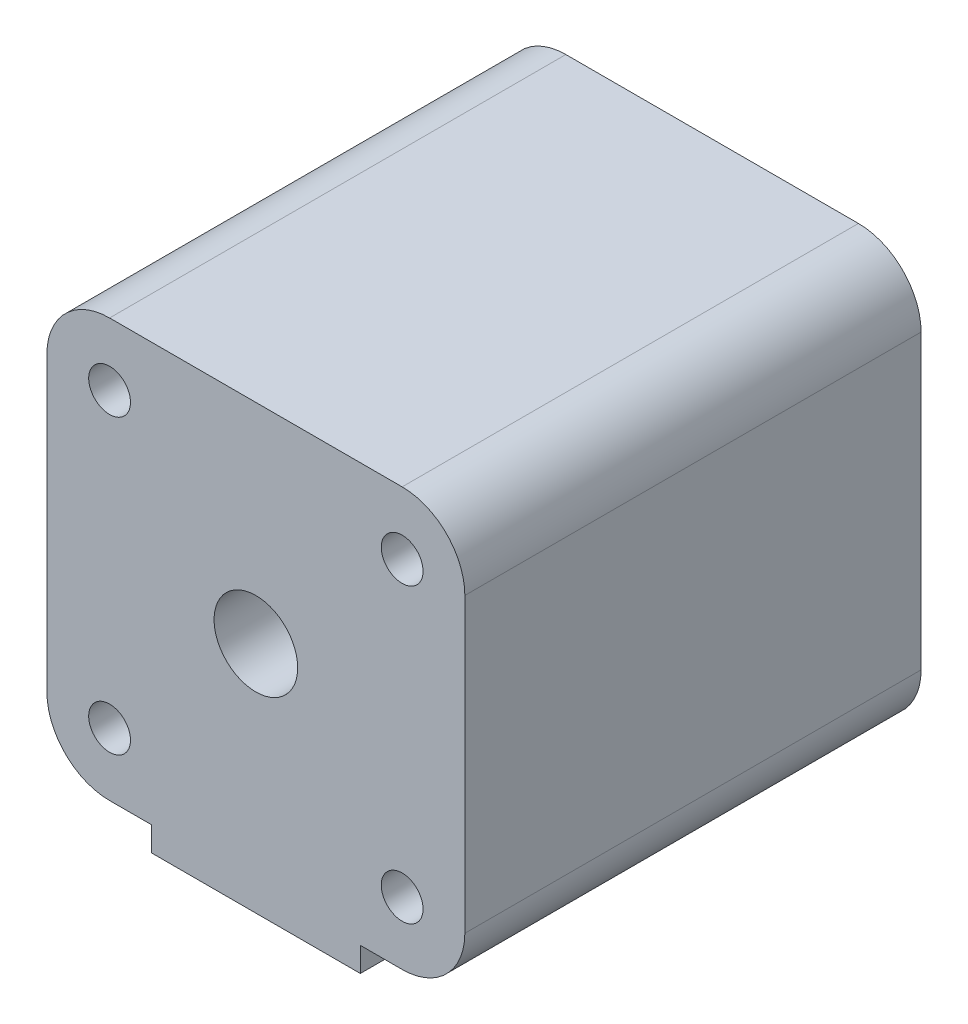
ISO-10303-21;
HEADER;
FILE_DESCRIPTION(('STEP AP214'),'2;1');
FILE_NAME('part.step','',(''),(''),'','','');
FILE_SCHEMA(('AUTOMOTIVE_DESIGN { 1 0 10303 214 1 1 1 1 }'));
ENDSEC;
DATA;
#1=APPLICATION_CONTEXT('core data for automotive mechanical design processes');
#2=APPLICATION_PROTOCOL_DEFINITION('international standard','automotive_design',2000,#1);
#3=PRODUCT_CONTEXT('',#1,'mechanical');
#4=PRODUCT('Part','Part','',(#3));
#5=PRODUCT_RELATED_PRODUCT_CATEGORY('part','',(#4));
#6=PRODUCT_DEFINITION_FORMATION('','',#4);
#7=PRODUCT_DEFINITION_CONTEXT('part definition',#1,'design');
#8=PRODUCT_DEFINITION('design','',#6,#7);
#9=PRODUCT_DEFINITION_SHAPE('','',#8);
#10=(LENGTH_UNIT() NAMED_UNIT(*) SI_UNIT(.MILLI.,.METRE.));
#11=(NAMED_UNIT(*) PLANE_ANGLE_UNIT() SI_UNIT($,.RADIAN.));
#12=(NAMED_UNIT(*) SI_UNIT($,.STERADIAN.) SOLID_ANGLE_UNIT());
#13=UNCERTAINTY_MEASURE_WITH_UNIT(LENGTH_MEASURE(1.E-05),#10,'distance_accuracy_value','');
#14=(GEOMETRIC_REPRESENTATION_CONTEXT(3) GLOBAL_UNCERTAINTY_ASSIGNED_CONTEXT((#13)) GLOBAL_UNIT_ASSIGNED_CONTEXT((#10,
#11,#12)) REPRESENTATION_CONTEXT('',''));
#15=CARTESIAN_POINT('',(0.,0.,0.));
#16=DIRECTION('',(0.,0.,1.));
#17=DIRECTION('',(1.,0.,0.));
#18=AXIS2_PLACEMENT_3D('',#15,#16,#17);
#19=CARTESIAN_POINT('',(21.,21.,-65.5));
#20=DIRECTION('',(0.,0.,1.));
#21=DIRECTION('',(1.,0.,0.));
#22=AXIS2_PLACEMENT_3D('',#19,#20,#21);
#23=CYLINDRICAL_SURFACE('',#22,9.);
#24=CARTESIAN_POINT('',(21.,21.,0.));
#25=DIRECTION('',(0.,0.,1.));
#26=DIRECTION('',(-1.,0.,0.));
#27=AXIS2_PLACEMENT_3D('',#24,#25,#26);
#28=CIRCLE('',#27,9.);
#29=CARTESIAN_POINT('',(30.,21.,0.));
#30=VERTEX_POINT('',#29);
#31=CARTESIAN_POINT('',(20.9999999999999,30.,0.));
#32=VERTEX_POINT('',#31);
#33=EDGE_CURVE('E154',#30,#32,#28,.T.);
#34=ORIENTED_EDGE('',*,*,#33,.F.);
#35=DIRECTION('',(0.,0.,1.));
#36=VECTOR('',#35,1.);
#37=CARTESIAN_POINT('',(30.,21.,-65.5));
#38=LINE('',#37,#36);
#39=CARTESIAN_POINT('',(30.,21.,-65.5));
#40=VERTEX_POINT('',#39);
#41=EDGE_CURVE('E11',#40,#30,#38,.T.);
#42=ORIENTED_EDGE('',*,*,#41,.F.);
#43=CARTESIAN_POINT('',(21.,21.,-65.5));
#44=DIRECTION('',(0.,0.,1.));
#45=DIRECTION('',(-1.,0.,0.));
#46=AXIS2_PLACEMENT_3D('',#43,#44,#45);
#47=CIRCLE('',#46,9.);
#48=CARTESIAN_POINT('',(20.9999999999999,30.,-65.5));
#49=VERTEX_POINT('',#48);
#50=EDGE_CURVE('E187',#40,#49,#47,.T.);
#51=ORIENTED_EDGE('',*,*,#50,.T.);
#52=DIRECTION('',(0.,0.,1.));
#53=VECTOR('',#52,1.);
#54=CARTESIAN_POINT('',(20.9999999999999,30.,-65.5));
#55=LINE('',#54,#53);
#56=EDGE_CURVE('E36',#49,#32,#55,.T.);
#57=ORIENTED_EDGE('',*,*,#56,.T.);
#58=EDGE_LOOP('',(#34,#42,#51,#57));
#59=FACE_BOUND('',#58,.T.);
#60=ADVANCED_FACE('F33',(#59),#23,.T.);
#61=CARTESIAN_POINT('',(30.,21.,-65.5));
#62=DIRECTION('',(1.,0.,0.));
#63=DIRECTION('',(0.,1.,0.));
#64=AXIS2_PLACEMENT_3D('',#61,#62,#63);
#65=PLANE('',#64);
#66=DIRECTION('',(0.,1.,0.));
#67=VECTOR('',#66,1.);
#68=CARTESIAN_POINT('',(30.,21.,0.));
#69=LINE('',#68,#67);
#70=CARTESIAN_POINT('',(30.,-20.9999999999999,0.));
#71=VERTEX_POINT('',#70);
#72=EDGE_CURVE('E185',#71,#30,#69,.T.);
#73=ORIENTED_EDGE('',*,*,#72,.F.);
#74=DIRECTION('',(0.,0.,1.));
#75=VECTOR('',#74,1.);
#76=CARTESIAN_POINT('',(30.,-20.9999999999999,-65.5));
#77=LINE('',#76,#75);
#78=CARTESIAN_POINT('',(30.,-20.9999999999999,-65.5));
#79=VERTEX_POINT('',#78);
#80=EDGE_CURVE('E42',#79,#71,#77,.T.);
#81=ORIENTED_EDGE('',*,*,#80,.F.);
#82=DIRECTION('',(0.,1.,0.));
#83=VECTOR('',#82,1.);
#84=CARTESIAN_POINT('',(30.,21.,-65.5));
#85=LINE('',#84,#83);
#86=EDGE_CURVE('E144',#79,#40,#85,.T.);
#87=ORIENTED_EDGE('',*,*,#86,.T.);
#88=ORIENTED_EDGE('',*,*,#41,.T.);
#89=EDGE_LOOP('',(#73,#81,#87,#88));
#90=FACE_BOUND('',#89,.T.);
#91=ADVANCED_FACE('F207',(#90),#65,.T.);
#92=CARTESIAN_POINT('',(21.,-21.,-65.5));
#93=DIRECTION('',(0.,0.,1.));
#94=DIRECTION('',(1.,0.,0.));
#95=AXIS2_PLACEMENT_3D('',#92,#93,#94);
#96=CYLINDRICAL_SURFACE('',#95,9.);
#97=CARTESIAN_POINT('',(21.,-21.,0.));
#98=DIRECTION('',(0.,0.,1.));
#99=DIRECTION('',(-1.,0.,0.));
#100=AXIS2_PLACEMENT_3D('',#97,#98,#99);
#101=CIRCLE('',#100,9.);
#102=CARTESIAN_POINT('',(20.9999999999999,-30.,0.));
#103=VERTEX_POINT('',#102);
#104=EDGE_CURVE('E131',#103,#71,#101,.T.);
#105=ORIENTED_EDGE('',*,*,#104,.F.);
#106=DIRECTION('',(0.,0.,1.));
#107=VECTOR('',#106,1.);
#108=CARTESIAN_POINT('',(20.9999999999999,-30.,-65.5));
#109=LINE('',#108,#107);
#110=CARTESIAN_POINT('',(20.9999999999999,-30.,-65.5));
#111=VERTEX_POINT('',#110);
#112=EDGE_CURVE('E126',#111,#103,#109,.T.);
#113=ORIENTED_EDGE('',*,*,#112,.F.);
#114=CARTESIAN_POINT('',(21.,-21.,-65.5));
#115=DIRECTION('',(0.,0.,1.));
#116=DIRECTION('',(-1.,0.,0.));
#117=AXIS2_PLACEMENT_3D('',#114,#115,#116);
#118=CIRCLE('',#117,9.);
#119=EDGE_CURVE('E129',#111,#79,#118,.T.);
#120=ORIENTED_EDGE('',*,*,#119,.T.);
#121=ORIENTED_EDGE('',*,*,#80,.T.);
#122=EDGE_LOOP('',(#105,#113,#120,#121));
#123=FACE_BOUND('',#122,.T.);
#124=ADVANCED_FACE('F128',(#123),#96,.T.);
#125=CARTESIAN_POINT('',(15.,-30.,-65.5));
#126=DIRECTION('',(0.,-1.,0.));
#127=DIRECTION('',(0.,0.,-1.));
#128=AXIS2_PLACEMENT_3D('',#125,#126,#127);
#129=PLANE('',#128);
#130=DIRECTION('',(1.,0.,0.));
#131=VECTOR('',#130,1.);
#132=CARTESIAN_POINT('',(15.,-30.,0.));
#133=LINE('',#132,#131);
#134=CARTESIAN_POINT('',(15.,-30.,0.));
#135=VERTEX_POINT('',#134);
#136=EDGE_CURVE('E182',#135,#103,#133,.T.);
#137=ORIENTED_EDGE('',*,*,#136,.F.);
#138=DIRECTION('',(0.,0.,1.));
#139=VECTOR('',#138,1.);
#140=CARTESIAN_POINT('',(15.,-30.,-65.5));
#141=LINE('',#140,#139);
#142=CARTESIAN_POINT('',(15.,-30.,-65.5));
#143=VERTEX_POINT('',#142);
#144=EDGE_CURVE('E136',#143,#135,#141,.T.);
#145=ORIENTED_EDGE('',*,*,#144,.F.);
#146=DIRECTION('',(1.,0.,0.));
#147=VECTOR('',#146,1.);
#148=CARTESIAN_POINT('',(15.,-30.,-65.5));
#149=LINE('',#148,#147);
#150=EDGE_CURVE('E142',#143,#111,#149,.T.);
#151=ORIENTED_EDGE('',*,*,#150,.T.);
#152=ORIENTED_EDGE('',*,*,#112,.T.);
#153=EDGE_LOOP('',(#137,#145,#151,#152));
#154=FACE_BOUND('',#153,.T.);
#155=ADVANCED_FACE('F146',(#154),#129,.T.);
#156=CARTESIAN_POINT('',(15.,-33.5,-65.5));
#157=DIRECTION('',(1.,0.,0.));
#158=DIRECTION('',(0.,0.,-1.));
#159=AXIS2_PLACEMENT_3D('',#156,#157,#158);
#160=PLANE('',#159);
#161=DIRECTION('',(0.,1.,0.));
#162=VECTOR('',#161,1.);
#163=CARTESIAN_POINT('',(15.,-33.5,0.));
#164=LINE('',#163,#162);
#165=CARTESIAN_POINT('',(15.,-33.5,0.));
#166=VERTEX_POINT('',#165);
#167=EDGE_CURVE('E179',#166,#135,#164,.T.);
#168=ORIENTED_EDGE('',*,*,#167,.F.);
#169=DIRECTION('',(0.,0.,1.));
#170=VECTOR('',#169,1.);
#171=CARTESIAN_POINT('',(15.,-33.5,-65.5));
#172=LINE('',#171,#170);
#173=CARTESIAN_POINT('',(15.,-33.5,-65.5));
#174=VERTEX_POINT('',#173);
#175=EDGE_CURVE('E191',#174,#166,#172,.T.);
#176=ORIENTED_EDGE('',*,*,#175,.F.);
#177=DIRECTION('',(0.,1.,0.));
#178=VECTOR('',#177,1.);
#179=CARTESIAN_POINT('',(15.,-33.5,-65.5));
#180=LINE('',#179,#178);
#181=EDGE_CURVE('E147',#174,#143,#180,.T.);
#182=ORIENTED_EDGE('',*,*,#181,.T.);
#183=ORIENTED_EDGE('',*,*,#144,.T.);
#184=EDGE_LOOP('',(#168,#176,#182,#183));
#185=FACE_BOUND('',#184,.T.);
#186=ADVANCED_FACE('F220',(#185),#160,.T.);
#187=CARTESIAN_POINT('',(-15.,-33.5,-65.5));
#188=DIRECTION('',(0.,-1.,0.));
#189=DIRECTION('',(0.,0.,-1.));
#190=AXIS2_PLACEMENT_3D('',#187,#188,#189);
#191=PLANE('',#190);
#192=CARTESIAN_POINT('',(0.,-33.5,-60.));
#193=DIRECTION('',(0.,-1.,0.));
#194=DIRECTION('',(0.,0.,-1.));
#195=AXIS2_PLACEMENT_3D('',#192,#193,#194);
#196=CIRCLE('',#195,4.5);
#197=CARTESIAN_POINT('',(0.,-33.5,-64.5));
#198=VERTEX_POINT('',#197);
#199=EDGE_CURVE('E317',#198,#198,#196,.T.);
#200=ORIENTED_EDGE('',*,*,#199,.F.);
#201=EDGE_LOOP('',(#200));
#202=FACE_BOUND('',#201,.T.);
#203=CARTESIAN_POINT('',(0.,-33.5,-5.5));
#204=DIRECTION('',(0.,-1.,0.));
#205=DIRECTION('',(0.,0.,-1.));
#206=AXIS2_PLACEMENT_3D('',#203,#204,#205);
#207=CIRCLE('',#206,4.5);
#208=CARTESIAN_POINT('',(0.,-33.5,-10.));
#209=VERTEX_POINT('',#208);
#210=EDGE_CURVE('E316',#209,#209,#207,.T.);
#211=ORIENTED_EDGE('',*,*,#210,.F.);
#212=EDGE_LOOP('',(#211));
#213=FACE_BOUND('',#212,.T.);
#214=DIRECTION('',(1.,0.,0.));
#215=VECTOR('',#214,1.);
#216=CARTESIAN_POINT('',(-15.,-33.5,0.));
#217=LINE('',#216,#215);
#218=CARTESIAN_POINT('',(-15.,-33.5,0.));
#219=VERTEX_POINT('',#218);
#220=EDGE_CURVE('E176',#219,#166,#217,.T.);
#221=ORIENTED_EDGE('',*,*,#220,.F.);
#222=DIRECTION('',(0.,0.,1.));
#223=VECTOR('',#222,1.);
#224=CARTESIAN_POINT('',(-15.,-33.5,-65.5));
#225=LINE('',#224,#223);
#226=CARTESIAN_POINT('',(-15.,-33.5,-65.5));
#227=VERTEX_POINT('',#226);
#228=EDGE_CURVE('E193',#227,#219,#225,.T.);
#229=ORIENTED_EDGE('',*,*,#228,.F.);
#230=DIRECTION('',(1.,0.,0.));
#231=VECTOR('',#230,1.);
#232=CARTESIAN_POINT('',(-15.,-33.5,-65.5));
#233=LINE('',#232,#231);
#234=EDGE_CURVE('E149',#227,#174,#233,.T.);
#235=ORIENTED_EDGE('',*,*,#234,.T.);
#236=ORIENTED_EDGE('',*,*,#175,.T.);
#237=EDGE_LOOP('',(#221,#229,#235,#236));
#238=FACE_BOUND('',#237,.T.);
#239=ADVANCED_FACE('F223',(#202,#213,#238),#191,.T.);
#240=CARTESIAN_POINT('',(-15.,-30.,-65.5));
#241=DIRECTION('',(-1.,0.,0.));
#242=DIRECTION('',(0.,0.,1.));
#243=AXIS2_PLACEMENT_3D('',#240,#241,#242);
#244=PLANE('',#243);
#245=DIRECTION('',(0.,-1.,0.));
#246=VECTOR('',#245,1.);
#247=CARTESIAN_POINT('',(-15.,-30.,0.));
#248=LINE('',#247,#246);
#249=CARTESIAN_POINT('',(-15.,-30.,0.));
#250=VERTEX_POINT('',#249);
#251=EDGE_CURVE('E173',#250,#219,#248,.T.);
#252=ORIENTED_EDGE('',*,*,#251,.F.);
#253=DIRECTION('',(0.,0.,1.));
#254=VECTOR('',#253,1.);
#255=CARTESIAN_POINT('',(-15.,-30.,-65.5));
#256=LINE('',#255,#254);
#257=CARTESIAN_POINT('',(-15.,-30.,-65.5));
#258=VERTEX_POINT('',#257);
#259=EDGE_CURVE('E195',#258,#250,#256,.T.);
#260=ORIENTED_EDGE('',*,*,#259,.F.);
#261=DIRECTION('',(0.,-1.,0.));
#262=VECTOR('',#261,1.);
#263=CARTESIAN_POINT('',(-15.,-30.,-65.5));
#264=LINE('',#263,#262);
#265=EDGE_CURVE('E371',#258,#227,#264,.T.);
#266=ORIENTED_EDGE('',*,*,#265,.T.);
#267=ORIENTED_EDGE('',*,*,#228,.T.);
#268=EDGE_LOOP('',(#252,#260,#266,#267));
#269=FACE_BOUND('',#268,.T.);
#270=ADVANCED_FACE('F227',(#269),#244,.T.);
#271=CARTESIAN_POINT('',(-20.9999999999999,-30.,-65.5));
#272=DIRECTION('',(0.,-1.,0.));
#273=DIRECTION('',(0.,0.,-1.));
#274=AXIS2_PLACEMENT_3D('',#271,#272,#273);
#275=PLANE('',#274);
#276=DIRECTION('',(1.,0.,0.));
#277=VECTOR('',#276,1.);
#278=CARTESIAN_POINT('',(-20.9999999999999,-30.,0.));
#279=LINE('',#278,#277);
#280=CARTESIAN_POINT('',(-20.9999999999999,-30.,0.));
#281=VERTEX_POINT('',#280);
#282=EDGE_CURVE('E170',#281,#250,#279,.T.);
#283=ORIENTED_EDGE('',*,*,#282,.F.);
#284=DIRECTION('',(0.,0.,1.));
#285=VECTOR('',#284,1.);
#286=CARTESIAN_POINT('',(-20.9999999999999,-30.,-65.5));
#287=LINE('',#286,#285);
#288=CARTESIAN_POINT('',(-20.9999999999999,-30.,-65.5));
#289=VERTEX_POINT('',#288);
#290=EDGE_CURVE('E197',#289,#281,#287,.T.);
#291=ORIENTED_EDGE('',*,*,#290,.F.);
#292=DIRECTION('',(1.,0.,0.));
#293=VECTOR('',#292,1.);
#294=CARTESIAN_POINT('',(-20.9999999999999,-30.,-65.5));
#295=LINE('',#294,#293);
#296=EDGE_CURVE('E368',#289,#258,#295,.T.);
#297=ORIENTED_EDGE('',*,*,#296,.T.);
#298=ORIENTED_EDGE('',*,*,#259,.T.);
#299=EDGE_LOOP('',(#283,#291,#297,#298));
#300=FACE_BOUND('',#299,.T.);
#301=ADVANCED_FACE('F231',(#300),#275,.T.);
#302=CARTESIAN_POINT('',(-21.,-21.,-65.5));
#303=DIRECTION('',(0.,0.,1.));
#304=DIRECTION('',(1.,0.,0.));
#305=AXIS2_PLACEMENT_3D('',#302,#303,#304);
#306=CYLINDRICAL_SURFACE('',#305,9.);
#307=CARTESIAN_POINT('',(-21.,-21.,0.));
#308=DIRECTION('',(0.,0.,1.));
#309=DIRECTION('',(-1.,0.,0.));
#310=AXIS2_PLACEMENT_3D('',#307,#308,#309);
#311=CIRCLE('',#310,9.);
#312=CARTESIAN_POINT('',(-30.,-20.9999999999999,0.));
#313=VERTEX_POINT('',#312);
#314=EDGE_CURVE('E167',#313,#281,#311,.T.);
#315=ORIENTED_EDGE('',*,*,#314,.F.);
#316=DIRECTION('',(0.,0.,1.));
#317=VECTOR('',#316,1.);
#318=CARTESIAN_POINT('',(-30.,-20.9999999999999,-65.5));
#319=LINE('',#318,#317);
#320=CARTESIAN_POINT('',(-30.,-20.9999999999999,-65.5));
#321=VERTEX_POINT('',#320);
#322=EDGE_CURVE('E199',#321,#313,#319,.T.);
#323=ORIENTED_EDGE('',*,*,#322,.F.);
#324=CARTESIAN_POINT('',(-21.,-21.,-65.5));
#325=DIRECTION('',(0.,0.,1.));
#326=DIRECTION('',(-1.,0.,0.));
#327=AXIS2_PLACEMENT_3D('',#324,#325,#326);
#328=CIRCLE('',#327,9.);
#329=EDGE_CURVE('E365',#321,#289,#328,.T.);
#330=ORIENTED_EDGE('',*,*,#329,.T.);
#331=ORIENTED_EDGE('',*,*,#290,.T.);
#332=EDGE_LOOP('',(#315,#323,#330,#331));
#333=FACE_BOUND('',#332,.T.);
#334=ADVANCED_FACE('F235',(#333),#306,.T.);
#335=CARTESIAN_POINT('',(-30.,20.9999999999999,-65.5));
#336=DIRECTION('',(-1.,0.,0.));
#337=DIRECTION('',(0.,-1.,0.));
#338=AXIS2_PLACEMENT_3D('',#335,#336,#337);
#339=PLANE('',#338);
#340=DIRECTION('',(0.,-1.,0.));
#341=VECTOR('',#340,1.);
#342=CARTESIAN_POINT('',(-30.,20.9999999999999,0.));
#343=LINE('',#342,#341);
#344=CARTESIAN_POINT('',(-30.,21.,0.));
#345=VERTEX_POINT('',#344);
#346=EDGE_CURVE('E164',#345,#313,#343,.T.);
#347=ORIENTED_EDGE('',*,*,#346,.F.);
#348=DIRECTION('',(0.,0.,1.));
#349=VECTOR('',#348,1.);
#350=CARTESIAN_POINT('',(-30.,21.,-65.5));
#351=LINE('',#350,#349);
#352=CARTESIAN_POINT('',(-30.,21.,-65.5));
#353=VERTEX_POINT('',#352);
#354=EDGE_CURVE('E201',#353,#345,#351,.T.);
#355=ORIENTED_EDGE('',*,*,#354,.F.);
#356=DIRECTION('',(0.,-1.,0.));
#357=VECTOR('',#356,1.);
#358=CARTESIAN_POINT('',(-30.,20.9999999999999,-65.5));
#359=LINE('',#358,#357);
#360=EDGE_CURVE('E362',#353,#321,#359,.T.);
#361=ORIENTED_EDGE('',*,*,#360,.T.);
#362=ORIENTED_EDGE('',*,*,#322,.T.);
#363=EDGE_LOOP('',(#347,#355,#361,#362));
#364=FACE_BOUND('',#363,.T.);
#365=ADVANCED_FACE('F239',(#364),#339,.T.);
#366=CARTESIAN_POINT('',(-21.,21.,-65.5));
#367=DIRECTION('',(0.,0.,1.));
#368=DIRECTION('',(1.,0.,0.));
#369=AXIS2_PLACEMENT_3D('',#366,#367,#368);
#370=CYLINDRICAL_SURFACE('',#369,9.);
#371=CARTESIAN_POINT('',(-21.,21.,0.));
#372=DIRECTION('',(0.,0.,1.));
#373=DIRECTION('',(1.,0.,0.));
#374=AXIS2_PLACEMENT_3D('',#371,#372,#373);
#375=CIRCLE('',#374,9.);
#376=CARTESIAN_POINT('',(-21.,30.,0.));
#377=VERTEX_POINT('',#376);
#378=EDGE_CURVE('E161',#377,#345,#375,.T.);
#379=ORIENTED_EDGE('',*,*,#378,.F.);
#380=DIRECTION('',(0.,0.,1.));
#381=VECTOR('',#380,1.);
#382=CARTESIAN_POINT('',(-21.,30.,-65.5));
#383=LINE('',#382,#381);
#384=CARTESIAN_POINT('',(-21.,30.,-65.5));
#385=VERTEX_POINT('',#384);
#386=EDGE_CURVE('E202',#385,#377,#383,.T.);
#387=ORIENTED_EDGE('',*,*,#386,.F.);
#388=CARTESIAN_POINT('',(-21.,21.,-65.5));
#389=DIRECTION('',(0.,0.,1.));
#390=DIRECTION('',(1.,0.,0.));
#391=AXIS2_PLACEMENT_3D('',#388,#389,#390);
#392=CIRCLE('',#391,9.);
#393=EDGE_CURVE('E359',#385,#353,#392,.T.);
#394=ORIENTED_EDGE('',*,*,#393,.T.);
#395=ORIENTED_EDGE('',*,*,#354,.T.);
#396=EDGE_LOOP('',(#379,#387,#394,#395));
#397=FACE_BOUND('',#396,.T.);
#398=ADVANCED_FACE('F243',(#397),#370,.T.);
#399=CARTESIAN_POINT('',(-21.,30.,-65.5));
#400=DIRECTION('',(0.,1.,0.));
#401=DIRECTION('',(0.,0.,1.));
#402=AXIS2_PLACEMENT_3D('',#399,#400,#401);
#403=PLANE('',#402);
#404=DIRECTION('',(-1.,0.,0.));
#405=VECTOR('',#404,1.);
#406=CARTESIAN_POINT('',(-21.,30.,0.));
#407=LINE('',#406,#405);
#408=EDGE_CURVE('E157',#32,#377,#407,.T.);
#409=ORIENTED_EDGE('',*,*,#408,.F.);
#410=ORIENTED_EDGE('',*,*,#56,.F.);
#411=DIRECTION('',(-1.,0.,0.));
#412=VECTOR('',#411,1.);
#413=CARTESIAN_POINT('',(-21.,30.,-65.5));
#414=LINE('',#413,#412);
#415=EDGE_CURVE('E357',#49,#385,#414,.T.);
#416=ORIENTED_EDGE('',*,*,#415,.T.);
#417=ORIENTED_EDGE('',*,*,#386,.T.);
#418=EDGE_LOOP('',(#409,#410,#416,#417));
#419=FACE_BOUND('',#418,.T.);
#420=ADVANCED_FACE('F204',(#419),#403,.T.);
#421=CARTESIAN_POINT('',(21.,21.,-65.5));
#422=DIRECTION('',(0.,0.,-1.));
#423=DIRECTION('',(-1.,0.,0.));
#424=AXIS2_PLACEMENT_3D('',#421,#422,#423);
#425=PLANE('',#424);
#426=ORIENTED_EDGE('',*,*,#50,.F.);
#427=ORIENTED_EDGE('',*,*,#86,.F.);
#428=ORIENTED_EDGE('',*,*,#119,.F.);
#429=ORIENTED_EDGE('',*,*,#150,.F.);
#430=ORIENTED_EDGE('',*,*,#181,.F.);
#431=ORIENTED_EDGE('',*,*,#234,.F.);
#432=ORIENTED_EDGE('',*,*,#265,.F.);
#433=ORIENTED_EDGE('',*,*,#296,.F.);
#434=ORIENTED_EDGE('',*,*,#329,.F.);
#435=ORIENTED_EDGE('',*,*,#360,.F.);
#436=ORIENTED_EDGE('',*,*,#393,.F.);
#437=ORIENTED_EDGE('',*,*,#415,.F.);
#438=EDGE_LOOP('',(#426,#427,#428,#429,#430,#431,#432,#433,#434,#435,#436,#437));
#439=FACE_BOUND('',#438,.T.);
#440=ADVANCED_FACE('F140',(#439),#425,.T.);
#441=CARTESIAN_POINT('',(21.,21.,0.));
#442=DIRECTION('',(0.,0.,-1.));
#443=DIRECTION('',(-1.,0.,0.));
#444=AXIS2_PLACEMENT_3D('',#441,#442,#443);
#445=PLANE('',#444);
#446=CARTESIAN_POINT('',(0.,0.,0.));
#447=DIRECTION('',(0.,0.,1.));
#448=DIRECTION('',(1.,0.,0.));
#449=AXIS2_PLACEMENT_3D('',#446,#447,#448);
#450=CIRCLE('',#449,6.);
#451=CARTESIAN_POINT('',(6.,0.,0.));
#452=VERTEX_POINT('',#451);
#453=EDGE_CURVE('E326',#452,#452,#450,.T.);
#454=ORIENTED_EDGE('',*,*,#453,.F.);
#455=EDGE_LOOP('',(#454));
#456=FACE_BOUND('',#455,.T.);
#457=CARTESIAN_POINT('',(-21.,-21.,0.));
#458=DIRECTION('',(0.,0.,1.));
#459=DIRECTION('',(1.,0.,0.));
#460=AXIS2_PLACEMENT_3D('',#457,#458,#459);
#461=CIRCLE('',#460,3.);
#462=CARTESIAN_POINT('',(-18.,-21.,0.));
#463=VERTEX_POINT('',#462);
#464=EDGE_CURVE('E331',#463,#463,#461,.T.);
#465=ORIENTED_EDGE('',*,*,#464,.F.);
#466=EDGE_LOOP('',(#465));
#467=FACE_BOUND('',#466,.T.);
#468=CARTESIAN_POINT('',(21.,-21.,0.));
#469=DIRECTION('',(0.,0.,1.));
#470=DIRECTION('',(1.,0.,0.));
#471=AXIS2_PLACEMENT_3D('',#468,#469,#470);
#472=CIRCLE('',#471,3.);
#473=CARTESIAN_POINT('',(24.,-21.,0.));
#474=VERTEX_POINT('',#473);
#475=EDGE_CURVE('E337',#474,#474,#472,.T.);
#476=ORIENTED_EDGE('',*,*,#475,.F.);
#477=EDGE_LOOP('',(#476));
#478=FACE_BOUND('',#477,.T.);
#479=CARTESIAN_POINT('',(21.,21.,0.));
#480=DIRECTION('',(0.,0.,1.));
#481=DIRECTION('',(1.,0.,0.));
#482=AXIS2_PLACEMENT_3D('',#479,#480,#481);
#483=CIRCLE('',#482,3.);
#484=CARTESIAN_POINT('',(24.,21.,0.));
#485=VERTEX_POINT('',#484);
#486=EDGE_CURVE('E343',#485,#485,#483,.T.);
#487=ORIENTED_EDGE('',*,*,#486,.F.);
#488=EDGE_LOOP('',(#487));
#489=FACE_BOUND('',#488,.T.);
#490=CARTESIAN_POINT('',(-21.,21.,0.));
#491=DIRECTION('',(0.,0.,1.));
#492=DIRECTION('',(1.,0.,0.));
#493=AXIS2_PLACEMENT_3D('',#490,#491,#492);
#494=CIRCLE('',#493,3.);
#495=CARTESIAN_POINT('',(-18.,21.,0.));
#496=VERTEX_POINT('',#495);
#497=EDGE_CURVE('E349',#496,#496,#494,.T.);
#498=ORIENTED_EDGE('',*,*,#497,.F.);
#499=EDGE_LOOP('',(#498));
#500=FACE_BOUND('',#499,.T.);
#501=ORIENTED_EDGE('',*,*,#33,.T.);
#502=ORIENTED_EDGE('',*,*,#408,.T.);
#503=ORIENTED_EDGE('',*,*,#378,.T.);
#504=ORIENTED_EDGE('',*,*,#346,.T.);
#505=ORIENTED_EDGE('',*,*,#314,.T.);
#506=ORIENTED_EDGE('',*,*,#282,.T.);
#507=ORIENTED_EDGE('',*,*,#251,.T.);
#508=ORIENTED_EDGE('',*,*,#220,.T.);
#509=ORIENTED_EDGE('',*,*,#167,.T.);
#510=ORIENTED_EDGE('',*,*,#136,.T.);
#511=ORIENTED_EDGE('',*,*,#104,.T.);
#512=ORIENTED_EDGE('',*,*,#72,.T.);
#513=EDGE_LOOP('',(#501,#502,#503,#504,#505,#506,#507,#508,#509,#510,#511,#512));
#514=FACE_BOUND('',#513,.T.);
#515=ADVANCED_FACE('F206',(#456,#467,#478,#489,#500,#514),#445,.F.);
#516=CARTESIAN_POINT('',(-21.,21.,-20.));
#517=DIRECTION('',(0.,0.,1.));
#518=DIRECTION('',(1.,0.,0.));
#519=AXIS2_PLACEMENT_3D('',#516,#517,#518);
#520=CYLINDRICAL_SURFACE('',#519,3.);
#521=CARTESIAN_POINT('',(-21.,21.,-20.));
#522=DIRECTION('',(0.,0.,1.));
#523=DIRECTION('',(1.,0.,0.));
#524=AXIS2_PLACEMENT_3D('',#521,#522,#523);
#525=CIRCLE('',#524,3.);
#526=CARTESIAN_POINT('',(-18.,21.,-20.));
#527=VERTEX_POINT('',#526);
#528=EDGE_CURVE('E158',#527,#527,#525,.T.);
#529=ORIENTED_EDGE('',*,*,#528,.F.);
#530=EDGE_LOOP('',(#529));
#531=FACE_BOUND('',#530,.T.);
#532=ORIENTED_EDGE('',*,*,#497,.T.);
#533=EDGE_LOOP('',(#532));
#534=FACE_BOUND('',#533,.T.);
#535=ADVANCED_FACE('F254',(#531,#534),#520,.F.);
#536=CARTESIAN_POINT('',(-21.,21.,-20.));
#537=DIRECTION('',(0.,0.,1.));
#538=DIRECTION('',(1.,0.,0.));
#539=AXIS2_PLACEMENT_3D('',#536,#537,#538);
#540=PLANE('',#539);
#541=ORIENTED_EDGE('',*,*,#528,.T.);
#542=EDGE_LOOP('',(#541));
#543=FACE_BOUND('',#542,.T.);
#544=ADVANCED_FACE('F259',(#543),#540,.T.);
#545=CARTESIAN_POINT('',(21.,21.,-20.));
#546=DIRECTION('',(0.,0.,1.));
#547=DIRECTION('',(1.,0.,0.));
#548=AXIS2_PLACEMENT_3D('',#545,#546,#547);
#549=CYLINDRICAL_SURFACE('',#548,3.);
#550=CARTESIAN_POINT('',(21.,21.,-20.));
#551=DIRECTION('',(0.,0.,1.));
#552=DIRECTION('',(1.,0.,0.));
#553=AXIS2_PLACEMENT_3D('',#550,#551,#552);
#554=CIRCLE('',#553,3.);
#555=CARTESIAN_POINT('',(24.,21.,-20.));
#556=VERTEX_POINT('',#555);
#557=EDGE_CURVE('E346',#556,#556,#554,.T.);
#558=ORIENTED_EDGE('',*,*,#557,.F.);
#559=EDGE_LOOP('',(#558));
#560=FACE_BOUND('',#559,.T.);
#561=ORIENTED_EDGE('',*,*,#486,.T.);
#562=EDGE_LOOP('',(#561));
#563=FACE_BOUND('',#562,.T.);
#564=ADVANCED_FACE('F263',(#560,#563),#549,.F.);
#565=CARTESIAN_POINT('',(21.,21.,-20.));
#566=DIRECTION('',(0.,0.,1.));
#567=DIRECTION('',(1.,0.,0.));
#568=AXIS2_PLACEMENT_3D('',#565,#566,#567);
#569=PLANE('',#568);
#570=ORIENTED_EDGE('',*,*,#557,.T.);
#571=EDGE_LOOP('',(#570));
#572=FACE_BOUND('',#571,.T.);
#573=ADVANCED_FACE('F267',(#572),#569,.T.);
#574=CARTESIAN_POINT('',(21.,-21.,-20.));
#575=DIRECTION('',(0.,0.,1.));
#576=DIRECTION('',(1.,0.,0.));
#577=AXIS2_PLACEMENT_3D('',#574,#575,#576);
#578=CYLINDRICAL_SURFACE('',#577,3.);
#579=CARTESIAN_POINT('',(21.,-21.,-20.));
#580=DIRECTION('',(0.,0.,1.));
#581=DIRECTION('',(1.,0.,0.));
#582=AXIS2_PLACEMENT_3D('',#579,#580,#581);
#583=CIRCLE('',#582,3.);
#584=CARTESIAN_POINT('',(24.,-21.,-20.));
#585=VERTEX_POINT('',#584);
#586=EDGE_CURVE('E340',#585,#585,#583,.T.);
#587=ORIENTED_EDGE('',*,*,#586,.F.);
#588=EDGE_LOOP('',(#587));
#589=FACE_BOUND('',#588,.T.);
#590=ORIENTED_EDGE('',*,*,#475,.T.);
#591=EDGE_LOOP('',(#590));
#592=FACE_BOUND('',#591,.T.);
#593=ADVANCED_FACE('F271',(#589,#592),#578,.F.);
#594=CARTESIAN_POINT('',(21.,-21.,-20.));
#595=DIRECTION('',(0.,0.,1.));
#596=DIRECTION('',(1.,0.,0.));
#597=AXIS2_PLACEMENT_3D('',#594,#595,#596);
#598=PLANE('',#597);
#599=ORIENTED_EDGE('',*,*,#586,.T.);
#600=EDGE_LOOP('',(#599));
#601=FACE_BOUND('',#600,.T.);
#602=ADVANCED_FACE('F275',(#601),#598,.T.);
#603=CARTESIAN_POINT('',(-21.,-21.,-20.));
#604=DIRECTION('',(0.,0.,1.));
#605=DIRECTION('',(1.,0.,0.));
#606=AXIS2_PLACEMENT_3D('',#603,#604,#605);
#607=CYLINDRICAL_SURFACE('',#606,3.);
#608=CARTESIAN_POINT('',(-21.,-21.,-20.));
#609=DIRECTION('',(0.,0.,1.));
#610=DIRECTION('',(1.,0.,0.));
#611=AXIS2_PLACEMENT_3D('',#608,#609,#610);
#612=CIRCLE('',#611,3.);
#613=CARTESIAN_POINT('',(-18.,-21.,-20.));
#614=VERTEX_POINT('',#613);
#615=EDGE_CURVE('E334',#614,#614,#612,.T.);
#616=ORIENTED_EDGE('',*,*,#615,.F.);
#617=EDGE_LOOP('',(#616));
#618=FACE_BOUND('',#617,.T.);
#619=ORIENTED_EDGE('',*,*,#464,.T.);
#620=EDGE_LOOP('',(#619));
#621=FACE_BOUND('',#620,.T.);
#622=ADVANCED_FACE('F279',(#618,#621),#607,.F.);
#623=CARTESIAN_POINT('',(-21.,-21.,-20.));
#624=DIRECTION('',(0.,0.,1.));
#625=DIRECTION('',(1.,0.,0.));
#626=AXIS2_PLACEMENT_3D('',#623,#624,#625);
#627=PLANE('',#626);
#628=ORIENTED_EDGE('',*,*,#615,.T.);
#629=EDGE_LOOP('',(#628));
#630=FACE_BOUND('',#629,.T.);
#631=ADVANCED_FACE('F283',(#630),#627,.T.);
#632=CARTESIAN_POINT('',(0.,0.,-20.));
#633=DIRECTION('',(0.,0.,1.));
#634=DIRECTION('',(1.,0.,0.));
#635=AXIS2_PLACEMENT_3D('',#632,#633,#634);
#636=CYLINDRICAL_SURFACE('',#635,6.);
#637=CARTESIAN_POINT('',(0.,0.,-20.));
#638=DIRECTION('',(0.,0.,1.));
#639=DIRECTION('',(1.,0.,0.));
#640=AXIS2_PLACEMENT_3D('',#637,#638,#639);
#641=CIRCLE('',#640,6.);
#642=CARTESIAN_POINT('',(6.,0.,-20.));
#643=VERTEX_POINT('',#642);
#644=EDGE_CURVE('E328',#643,#643,#641,.T.);
#645=ORIENTED_EDGE('',*,*,#644,.F.);
#646=EDGE_LOOP('',(#645));
#647=FACE_BOUND('',#646,.T.);
#648=ORIENTED_EDGE('',*,*,#453,.T.);
#649=EDGE_LOOP('',(#648));
#650=FACE_BOUND('',#649,.T.);
#651=ADVANCED_FACE('F287',(#647,#650),#636,.F.);
#652=CARTESIAN_POINT('',(0.,0.,-20.));
#653=DIRECTION('',(0.,0.,1.));
#654=DIRECTION('',(1.,0.,0.));
#655=AXIS2_PLACEMENT_3D('',#652,#653,#654);
#656=PLANE('',#655);
#657=ORIENTED_EDGE('',*,*,#644,.T.);
#658=EDGE_LOOP('',(#657));
#659=FACE_BOUND('',#658,.T.);
#660=ADVANCED_FACE('F291',(#659),#656,.T.);
#661=CARTESIAN_POINT('',(0.,-27.5,-5.5));
#662=DIRECTION('',(0.,-1.,0.));
#663=DIRECTION('',(0.,0.,-1.));
#664=AXIS2_PLACEMENT_3D('',#661,#662,#663);
#665=CYLINDRICAL_SURFACE('',#664,4.5);
#666=CARTESIAN_POINT('',(0.,-27.5,-5.5));
#667=DIRECTION('',(0.,-1.,0.));
#668=DIRECTION('',(0.,0.,-1.));
#669=AXIS2_PLACEMENT_3D('',#666,#667,#668);
#670=CIRCLE('',#669,4.5);
#671=CARTESIAN_POINT('',(0.,-27.5,-10.));
#672=VERTEX_POINT('',#671);
#673=EDGE_CURVE('E320',#672,#672,#670,.T.);
#674=ORIENTED_EDGE('',*,*,#673,.F.);
#675=EDGE_LOOP('',(#674));
#676=FACE_BOUND('',#675,.T.);
#677=ORIENTED_EDGE('',*,*,#210,.T.);
#678=EDGE_LOOP('',(#677));
#679=FACE_BOUND('',#678,.T.);
#680=ADVANCED_FACE('F295',(#676,#679),#665,.F.);
#681=CARTESIAN_POINT('',(0.,-27.5,-5.5));
#682=DIRECTION('',(0.,-1.,0.));
#683=DIRECTION('',(0.,0.,-1.));
#684=AXIS2_PLACEMENT_3D('',#681,#682,#683);
#685=PLANE('',#684);
#686=ORIENTED_EDGE('',*,*,#673,.T.);
#687=EDGE_LOOP('',(#686));
#688=FACE_BOUND('',#687,.T.);
#689=ADVANCED_FACE('F299',(#688),#685,.T.);
#690=CARTESIAN_POINT('',(0.,-27.5,-60.));
#691=DIRECTION('',(0.,-1.,0.));
#692=DIRECTION('',(0.,0.,-1.));
#693=AXIS2_PLACEMENT_3D('',#690,#691,#692);
#694=CYLINDRICAL_SURFACE('',#693,4.5);
#695=CARTESIAN_POINT('',(0.,-27.5,-60.));
#696=DIRECTION('',(0.,-1.,0.));
#697=DIRECTION('',(0.,0.,-1.));
#698=AXIS2_PLACEMENT_3D('',#695,#696,#697);
#699=CIRCLE('',#698,4.5);
#700=CARTESIAN_POINT('',(0.,-27.5,-64.5));
#701=VERTEX_POINT('',#700);
#702=EDGE_CURVE('E315',#701,#701,#699,.T.);
#703=ORIENTED_EDGE('',*,*,#702,.F.);
#704=EDGE_LOOP('',(#703));
#705=FACE_BOUND('',#704,.T.);
#706=ORIENTED_EDGE('',*,*,#199,.T.);
#707=EDGE_LOOP('',(#706));
#708=FACE_BOUND('',#707,.T.);
#709=ADVANCED_FACE('F303',(#705,#708),#694,.F.);
#710=CARTESIAN_POINT('',(0.,-27.5,-60.));
#711=DIRECTION('',(0.,-1.,0.));
#712=DIRECTION('',(0.,0.,-1.));
#713=AXIS2_PLACEMENT_3D('',#710,#711,#712);
#714=PLANE('',#713);
#715=ORIENTED_EDGE('',*,*,#702,.T.);
#716=EDGE_LOOP('',(#715));
#717=FACE_BOUND('',#716,.T.);
#718=ADVANCED_FACE('F307',(#717),#714,.T.);
#719=CLOSED_SHELL('',(#60,#91,#124,#155,#186,#239,#270,#301,#334,#365,#398,#420,#440,#515,#535,
#544,#564,#573,#593,#602,#622,#631,#651,#660,#680,#689,#709,#718));
#720=MANIFOLD_SOLID_BREP('B2',#719);
#721=ADVANCED_BREP_SHAPE_REPRESENTATION('',(#18,#720),#14);
#722=SHAPE_DEFINITION_REPRESENTATION(#9,#721);
ENDSEC;
END-ISO-10303-21;
